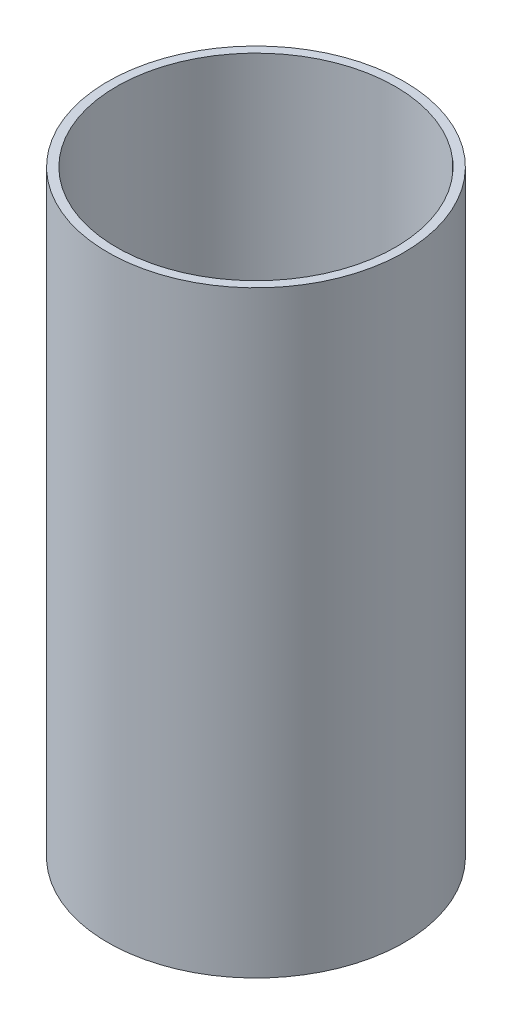
ISO-10303-21;
HEADER;
FILE_DESCRIPTION(('STEP AP214'),'2;1');
FILE_NAME('part.step','',(''),(''),'','','');
FILE_SCHEMA(('AUTOMOTIVE_DESIGN { 1 0 10303 214 1 1 1 1 }'));
ENDSEC;
DATA;
#1=APPLICATION_CONTEXT('core data for automotive mechanical design processes');
#2=APPLICATION_PROTOCOL_DEFINITION('international standard','automotive_design',2000,#1);
#3=PRODUCT_CONTEXT('',#1,'mechanical');
#4=PRODUCT('Part','Part','',(#3));
#5=PRODUCT_RELATED_PRODUCT_CATEGORY('part','',(#4));
#6=PRODUCT_DEFINITION_FORMATION('','',#4);
#7=PRODUCT_DEFINITION_CONTEXT('part definition',#1,'design');
#8=PRODUCT_DEFINITION('design','',#6,#7);
#9=PRODUCT_DEFINITION_SHAPE('','',#8);
#10=(LENGTH_UNIT() NAMED_UNIT(*) SI_UNIT(.MILLI.,.METRE.));
#11=(NAMED_UNIT(*) PLANE_ANGLE_UNIT() SI_UNIT($,.RADIAN.));
#12=(NAMED_UNIT(*) SI_UNIT($,.STERADIAN.) SOLID_ANGLE_UNIT());
#13=UNCERTAINTY_MEASURE_WITH_UNIT(LENGTH_MEASURE(1.E-05),#10,'distance_accuracy_value','');
#14=(GEOMETRIC_REPRESENTATION_CONTEXT(3) GLOBAL_UNCERTAINTY_ASSIGNED_CONTEXT((#13)) GLOBAL_UNIT_ASSIGNED_CONTEXT((#10,
#11,#12)) REPRESENTATION_CONTEXT('',''));
#15=CARTESIAN_POINT('',(0.,0.,0.));
#16=DIRECTION('',(0.,0.,1.));
#17=DIRECTION('',(1.,0.,0.));
#18=AXIS2_PLACEMENT_3D('',#15,#16,#17);
#19=CARTESIAN_POINT('',(0.,0.,0.));
#20=DIRECTION('',(0.,-1.,0.));
#21=DIRECTION('',(0.,0.,-1.));
#22=AXIS2_PLACEMENT_3D('',#19,#20,#21);
#23=CYLINDRICAL_SURFACE('',#22,25.4);
#24=CARTESIAN_POINT('',(0.,-101.893996080476,0.));
#25=DIRECTION('',(0.,-1.,0.));
#26=DIRECTION('',(0.,0.,-1.));
#27=AXIS2_PLACEMENT_3D('',#24,#25,#26);
#28=CIRCLE('',#27,25.4);
#29=CARTESIAN_POINT('',(0.,-101.893996080476,-25.4));
#30=VERTEX_POINT('',#29);
#31=EDGE_CURVE('E10',#30,#30,#28,.T.);
#32=ORIENTED_EDGE('',*,*,#31,.T.);
#33=EDGE_LOOP('',(#32));
#34=FACE_BOUND('',#33,.T.);
#35=CARTESIAN_POINT('',(0.,7.03760547397869,0.));
#36=DIRECTION('',(0.,-1.,0.));
#37=DIRECTION('',(0.,0.,-1.));
#38=AXIS2_PLACEMENT_3D('',#35,#36,#37);
#39=CIRCLE('',#38,25.4);
#40=CARTESIAN_POINT('',(0.,7.03760547397869,-25.4));
#41=VERTEX_POINT('',#40);
#42=EDGE_CURVE('E51',#41,#41,#39,.T.);
#43=ORIENTED_EDGE('',*,*,#42,.F.);
#44=EDGE_LOOP('',(#43));
#45=FACE_BOUND('',#44,.T.);
#46=ADVANCED_FACE('F37',(#34,#45),#23,.F.);
#47=CARTESIAN_POINT('',(25.4,-101.893996080476,0.));
#48=DIRECTION('',(0.,-1.,0.));
#49=DIRECTION('',(0.,0.,-1.));
#50=AXIS2_PLACEMENT_3D('',#47,#48,#49);
#51=PLANE('',#50);
#52=CARTESIAN_POINT('',(0.,-101.893996080476,0.));
#53=DIRECTION('',(0.,-1.,0.));
#54=DIRECTION('',(0.,0.,-1.));
#55=AXIS2_PLACEMENT_3D('',#52,#53,#54);
#56=CIRCLE('',#55,26.9875);
#57=CARTESIAN_POINT('',(0.,-101.893996080476,-26.9875));
#58=VERTEX_POINT('',#57);
#59=EDGE_CURVE('E43',#58,#58,#56,.T.);
#60=ORIENTED_EDGE('',*,*,#59,.T.);
#61=EDGE_LOOP('',(#60));
#62=FACE_BOUND('',#61,.T.);
#63=ORIENTED_EDGE('',*,*,#31,.F.);
#64=EDGE_LOOP('',(#63));
#65=FACE_BOUND('',#64,.T.);
#66=ADVANCED_FACE('F61',(#62,#65),#51,.T.);
#67=CARTESIAN_POINT('',(0.,0.,0.));
#68=DIRECTION('',(0.,-1.,0.));
#69=DIRECTION('',(0.,0.,-1.));
#70=AXIS2_PLACEMENT_3D('',#67,#68,#69);
#71=CYLINDRICAL_SURFACE('',#70,26.9875);
#72=CARTESIAN_POINT('',(0.,7.03760547397869,0.));
#73=DIRECTION('',(0.,-1.,0.));
#74=DIRECTION('',(0.,0.,-1.));
#75=AXIS2_PLACEMENT_3D('',#72,#73,#74);
#76=CIRCLE('',#75,26.9875);
#77=CARTESIAN_POINT('',(0.,7.03760547397869,-26.9875));
#78=VERTEX_POINT('',#77);
#79=EDGE_CURVE('E47',#78,#78,#76,.T.);
#80=ORIENTED_EDGE('',*,*,#79,.T.);
#81=EDGE_LOOP('',(#80));
#82=FACE_BOUND('',#81,.T.);
#83=ORIENTED_EDGE('',*,*,#59,.F.);
#84=EDGE_LOOP('',(#83));
#85=FACE_BOUND('',#84,.T.);
#86=ADVANCED_FACE('F65',(#82,#85),#71,.T.);
#87=CARTESIAN_POINT('',(25.4,7.03760547397869,0.));
#88=DIRECTION('',(0.,1.,0.));
#89=DIRECTION('',(0.,0.,1.));
#90=AXIS2_PLACEMENT_3D('',#87,#88,#89);
#91=PLANE('',#90);
#92=ORIENTED_EDGE('',*,*,#42,.T.);
#93=EDGE_LOOP('',(#92));
#94=FACE_BOUND('',#93,.T.);
#95=ORIENTED_EDGE('',*,*,#79,.F.);
#96=EDGE_LOOP('',(#95));
#97=FACE_BOUND('',#96,.T.);
#98=ADVANCED_FACE('F57',(#94,#97),#91,.T.);
#99=CLOSED_SHELL('',(#46,#66,#86,#98));
#100=MANIFOLD_SOLID_BREP('B2',#99);
#101=ADVANCED_BREP_SHAPE_REPRESENTATION('',(#18,#100),#14);
#102=SHAPE_DEFINITION_REPRESENTATION(#9,#101);
ENDSEC;
END-ISO-10303-21;
